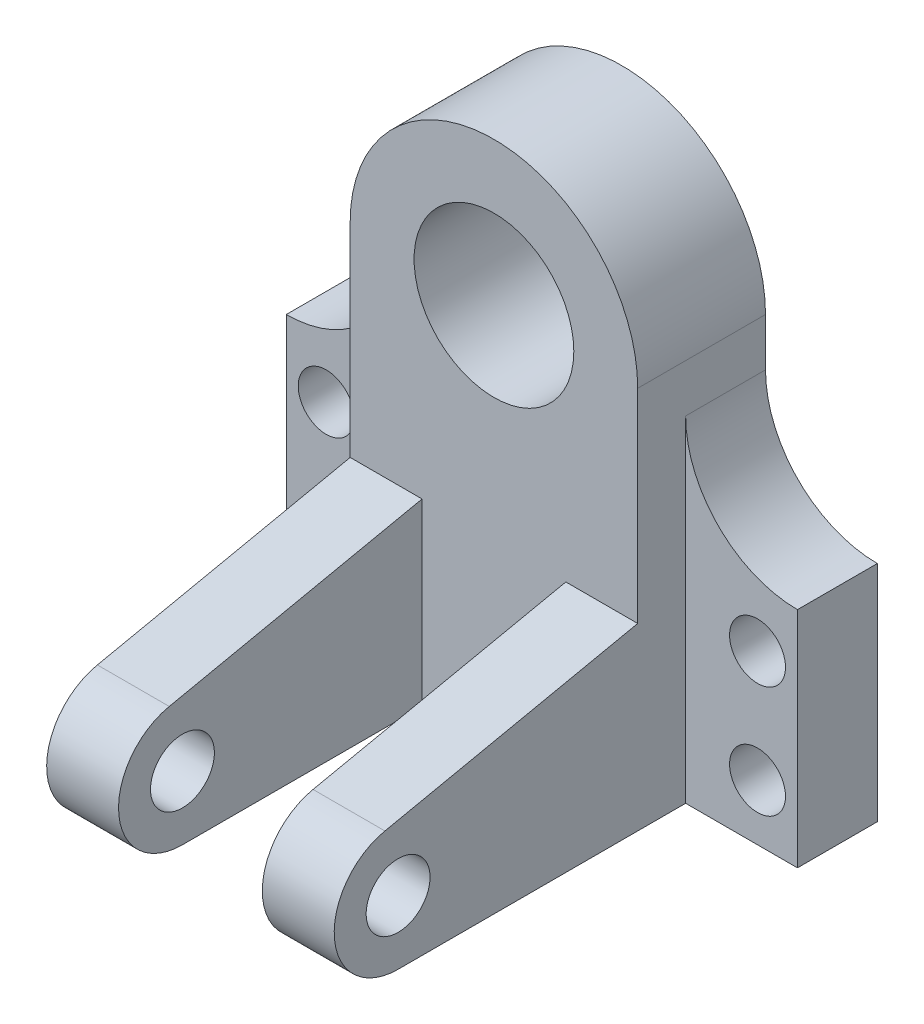
ISO-10303-21;
HEADER;
FILE_DESCRIPTION(('STEP AP214'),'2;1');
FILE_NAME('part.step','',(''),(''),'','','');
FILE_SCHEMA(('AUTOMOTIVE_DESIGN { 1 0 10303 214 1 1 1 1 }'));
ENDSEC;
DATA;
#1=APPLICATION_CONTEXT('core data for automotive mechanical design processes');
#2=APPLICATION_PROTOCOL_DEFINITION('international standard','automotive_design',2000,#1);
#3=PRODUCT_CONTEXT('',#1,'mechanical');
#4=PRODUCT('Part','Part','',(#3));
#5=PRODUCT_RELATED_PRODUCT_CATEGORY('part','',(#4));
#6=PRODUCT_DEFINITION_FORMATION('','',#4);
#7=PRODUCT_DEFINITION_CONTEXT('part definition',#1,'design');
#8=PRODUCT_DEFINITION('design','',#6,#7);
#9=PRODUCT_DEFINITION_SHAPE('','',#8);
#10=(LENGTH_UNIT() NAMED_UNIT(*) SI_UNIT(.MILLI.,.METRE.));
#11=(NAMED_UNIT(*) PLANE_ANGLE_UNIT() SI_UNIT($,.RADIAN.));
#12=(NAMED_UNIT(*) SI_UNIT($,.STERADIAN.) SOLID_ANGLE_UNIT());
#13=UNCERTAINTY_MEASURE_WITH_UNIT(LENGTH_MEASURE(1.E-05),#10,'distance_accuracy_value','');
#14=(GEOMETRIC_REPRESENTATION_CONTEXT(3) GLOBAL_UNCERTAINTY_ASSIGNED_CONTEXT((#13)) GLOBAL_UNIT_ASSIGNED_CONTEXT((#10,
#11,#12)) REPRESENTATION_CONTEXT('',''));
#15=CARTESIAN_POINT('',(0.,0.,0.));
#16=DIRECTION('',(0.,0.,1.));
#17=DIRECTION('',(1.,0.,0.));
#18=AXIS2_PLACEMENT_3D('',#15,#16,#17);
#19=CARTESIAN_POINT('',(0.,96.,32.));
#20=DIRECTION('',(0.,0.,1.));
#21=DIRECTION('',(1.,0.,0.));
#22=AXIS2_PLACEMENT_3D('',#19,#20,#21);
#23=PLANE('',#22);
#24=CARTESIAN_POINT('',(0.,96.,32.));
#25=DIRECTION('',(0.,0.,1.));
#26=DIRECTION('',(1.,0.,0.));
#27=AXIS2_PLACEMENT_3D('',#24,#25,#26);
#28=CIRCLE('',#27,20.);
#29=CARTESIAN_POINT('',(20.,96.,32.));
#30=VERTEX_POINT('',#29);
#31=EDGE_CURVE('E312',#30,#30,#28,.T.);
#32=ORIENTED_EDGE('',*,*,#31,.F.);
#33=EDGE_LOOP('',(#32));
#34=FACE_BOUND('',#33,.T.);
#35=DIRECTION('',(1.,0.,0.));
#36=VECTOR('',#35,1.);
#37=CARTESIAN_POINT('',(-36.,0.,32.));
#38=LINE('',#37,#36);
#39=CARTESIAN_POINT('',(-18.,0.,32.));
#40=VERTEX_POINT('',#39);
#41=CARTESIAN_POINT('',(18.,0.,32.));
#42=VERTEX_POINT('',#41);
#43=EDGE_CURVE('E66',#40,#42,#38,.T.);
#44=ORIENTED_EDGE('',*,*,#43,.T.);
#45=DIRECTION('',(0.,-1.,0.));
#46=VECTOR('',#45,1.);
#47=CARTESIAN_POINT('',(18.,45.,32.));
#48=LINE('',#47,#46);
#49=CARTESIAN_POINT('',(18.,45.,32.));
#50=VERTEX_POINT('',#49);
#51=EDGE_CURVE('E61',#50,#42,#48,.T.);
#52=ORIENTED_EDGE('',*,*,#51,.F.);
#53=DIRECTION('',(1.,0.,0.));
#54=VECTOR('',#53,1.);
#55=CARTESIAN_POINT('',(18.,45.,32.));
#56=LINE('',#55,#54);
#57=CARTESIAN_POINT('',(36.,45.,32.));
#58=VERTEX_POINT('',#57);
#59=EDGE_CURVE('E182',#50,#58,#56,.T.);
#60=ORIENTED_EDGE('',*,*,#59,.T.);
#61=DIRECTION('',(0.,1.,0.));
#62=VECTOR('',#61,1.);
#63=CARTESIAN_POINT('',(36.,0.,32.));
#64=LINE('',#63,#62);
#65=CARTESIAN_POINT('',(36.,96.,32.));
#66=VERTEX_POINT('',#65);
#67=EDGE_CURVE('E331',#58,#66,#64,.T.);
#68=ORIENTED_EDGE('',*,*,#67,.T.);
#69=CARTESIAN_POINT('',(0.,96.,32.));
#70=DIRECTION('',(0.,0.,1.));
#71=DIRECTION('',(1.,0.,0.));
#72=AXIS2_PLACEMENT_3D('',#69,#70,#71);
#73=CIRCLE('',#72,36.);
#74=CARTESIAN_POINT('',(-36.,96.,32.));
#75=VERTEX_POINT('',#74);
#76=EDGE_CURVE('E320',#66,#75,#73,.T.);
#77=ORIENTED_EDGE('',*,*,#76,.T.);
#78=DIRECTION('',(0.,-1.,0.));
#79=VECTOR('',#78,1.);
#80=CARTESIAN_POINT('',(-36.,96.,32.));
#81=LINE('',#80,#79);
#82=CARTESIAN_POINT('',(-36.,45.,32.));
#83=VERTEX_POINT('',#82);
#84=EDGE_CURVE('E324',#75,#83,#81,.T.);
#85=ORIENTED_EDGE('',*,*,#84,.T.);
#86=DIRECTION('',(-1.,0.,0.));
#87=VECTOR('',#86,1.);
#88=CARTESIAN_POINT('',(-18.,45.,32.));
#89=LINE('',#88,#87);
#90=CARTESIAN_POINT('',(-18.,45.,32.));
#91=VERTEX_POINT('',#90);
#92=EDGE_CURVE('E235',#91,#83,#89,.T.);
#93=ORIENTED_EDGE('',*,*,#92,.F.);
#94=DIRECTION('',(0.,-1.,0.));
#95=VECTOR('',#94,1.);
#96=CARTESIAN_POINT('',(-18.,45.,32.));
#97=LINE('',#96,#95);
#98=EDGE_CURVE('E212',#91,#40,#97,.T.);
#99=ORIENTED_EDGE('',*,*,#98,.T.);
#100=EDGE_LOOP('',(#44,#52,#60,#68,#77,#85,#93,#99));
#101=FACE_BOUND('',#100,.T.);
#102=ADVANCED_FACE('F45',(#34,#101),#23,.T.);
#103=CARTESIAN_POINT('',(0.,96.,0.));
#104=DIRECTION('',(0.,0.,1.));
#105=DIRECTION('',(1.,0.,0.));
#106=AXIS2_PLACEMENT_3D('',#103,#104,#105);
#107=PLANE('',#106);
#108=CARTESIAN_POINT('',(-54.,14.,0.));
#109=DIRECTION('',(0.,0.,1.));
#110=DIRECTION('',(1.,0.,0.));
#111=AXIS2_PLACEMENT_3D('',#108,#109,#110);
#112=CIRCLE('',#111,7.00000000000001);
#113=CARTESIAN_POINT('',(-47.,14.,0.));
#114=VERTEX_POINT('',#113);
#115=EDGE_CURVE('E687',#114,#114,#112,.T.);
#116=ORIENTED_EDGE('',*,*,#115,.T.);
#117=EDGE_LOOP('',(#116));
#118=FACE_BOUND('',#117,.T.);
#119=CARTESIAN_POINT('',(-54.,42.,0.));
#120=DIRECTION('',(0.,0.,1.));
#121=DIRECTION('',(1.,0.,0.));
#122=AXIS2_PLACEMENT_3D('',#119,#120,#121);
#123=CIRCLE('',#122,7.00000000000001);
#124=CARTESIAN_POINT('',(-47.,42.,0.));
#125=VERTEX_POINT('',#124);
#126=EDGE_CURVE('E679',#125,#125,#123,.T.);
#127=ORIENTED_EDGE('',*,*,#126,.T.);
#128=EDGE_LOOP('',(#127));
#129=FACE_BOUND('',#128,.T.);
#130=CARTESIAN_POINT('',(54.,14.,0.));
#131=DIRECTION('',(0.,0.,1.));
#132=DIRECTION('',(1.,0.,0.));
#133=AXIS2_PLACEMENT_3D('',#130,#131,#132);
#134=CIRCLE('',#133,7.00000000000001);
#135=CARTESIAN_POINT('',(61.,14.,0.));
#136=VERTEX_POINT('',#135);
#137=EDGE_CURVE('E671',#136,#136,#134,.T.);
#138=ORIENTED_EDGE('',*,*,#137,.T.);
#139=EDGE_LOOP('',(#138));
#140=FACE_BOUND('',#139,.T.);
#141=CARTESIAN_POINT('',(54.,42.,0.));
#142=DIRECTION('',(0.,0.,1.));
#143=DIRECTION('',(1.,0.,0.));
#144=AXIS2_PLACEMENT_3D('',#141,#142,#143);
#145=CIRCLE('',#144,7.00000000000001);
#146=CARTESIAN_POINT('',(61.,42.,0.));
#147=VERTEX_POINT('',#146);
#148=EDGE_CURVE('E660',#147,#147,#145,.T.);
#149=ORIENTED_EDGE('',*,*,#148,.T.);
#150=EDGE_LOOP('',(#149));
#151=FACE_BOUND('',#150,.T.);
#152=CARTESIAN_POINT('',(0.,96.,0.));
#153=DIRECTION('',(0.,0.,1.));
#154=DIRECTION('',(1.,0.,0.));
#155=AXIS2_PLACEMENT_3D('',#152,#153,#154);
#156=CIRCLE('',#155,36.);
#157=CARTESIAN_POINT('',(36.,96.,0.));
#158=VERTEX_POINT('',#157);
#159=CARTESIAN_POINT('',(-36.,96.,0.));
#160=VERTEX_POINT('',#159);
#161=EDGE_CURVE('E316',#158,#160,#156,.T.);
#162=ORIENTED_EDGE('',*,*,#161,.F.);
#163=DIRECTION('',(0.,1.,0.));
#164=VECTOR('',#163,1.);
#165=CARTESIAN_POINT('',(36.,0.,0.));
#166=LINE('',#165,#164);
#167=CARTESIAN_POINT('',(36.,84.,0.));
#168=VERTEX_POINT('',#167);
#169=EDGE_CURVE('E325',#168,#158,#166,.T.);
#170=ORIENTED_EDGE('',*,*,#169,.F.);
#171=CARTESIAN_POINT('',(64.,84.,0.));
#172=DIRECTION('',(0.,0.,-1.));
#173=DIRECTION('',(-1.,0.,0.));
#174=AXIS2_PLACEMENT_3D('',#171,#172,#173);
#175=CIRCLE('',#174,28.);
#176=CARTESIAN_POINT('',(64.,56.,0.));
#177=VERTEX_POINT('',#176);
#178=EDGE_CURVE('E284',#177,#168,#175,.T.);
#179=ORIENTED_EDGE('',*,*,#178,.F.);
#180=DIRECTION('',(0.,1.,0.));
#181=VECTOR('',#180,1.);
#182=CARTESIAN_POINT('',(64.,0.,0.));
#183=LINE('',#182,#181);
#184=CARTESIAN_POINT('',(64.,0.,0.));
#185=VERTEX_POINT('',#184);
#186=EDGE_CURVE('E278',#185,#177,#183,.T.);
#187=ORIENTED_EDGE('',*,*,#186,.F.);
#188=DIRECTION('',(1.,0.,0.));
#189=VECTOR('',#188,1.);
#190=CARTESIAN_POINT('',(-36.,0.,0.));
#191=LINE('',#190,#189);
#192=CARTESIAN_POINT('',(-64.,0.,0.));
#193=VERTEX_POINT('',#192);
#194=EDGE_CURVE('E342',#193,#185,#191,.T.);
#195=ORIENTED_EDGE('',*,*,#194,.F.);
#196=DIRECTION('',(0.,1.,0.));
#197=VECTOR('',#196,1.);
#198=CARTESIAN_POINT('',(-64.,0.,0.));
#199=LINE('',#198,#197);
#200=CARTESIAN_POINT('',(-64.,56.,0.));
#201=VERTEX_POINT('',#200);
#202=EDGE_CURVE('E250',#193,#201,#199,.T.);
#203=ORIENTED_EDGE('',*,*,#202,.T.);
#204=CARTESIAN_POINT('',(-64.,84.,0.));
#205=DIRECTION('',(0.,0.,1.));
#206=DIRECTION('',(1.,0.,0.));
#207=AXIS2_PLACEMENT_3D('',#204,#205,#206);
#208=CIRCLE('',#207,28.);
#209=CARTESIAN_POINT('',(-36.,84.,0.));
#210=VERTEX_POINT('',#209);
#211=EDGE_CURVE('E238',#201,#210,#208,.T.);
#212=ORIENTED_EDGE('',*,*,#211,.T.);
#213=DIRECTION('',(0.,-1.,0.));
#214=VECTOR('',#213,1.);
#215=CARTESIAN_POINT('',(-36.,96.,0.));
#216=LINE('',#215,#214);
#217=EDGE_CURVE('E338',#160,#210,#216,.T.);
#218=ORIENTED_EDGE('',*,*,#217,.F.);
#219=EDGE_LOOP('',(#162,#170,#179,#187,#195,#203,#212,#218));
#220=FACE_BOUND('',#219,.T.);
#221=CARTESIAN_POINT('',(0.,96.,0.));
#222=DIRECTION('',(0.,0.,1.));
#223=DIRECTION('',(1.,0.,0.));
#224=AXIS2_PLACEMENT_3D('',#221,#222,#223);
#225=CIRCLE('',#224,20.);
#226=CARTESIAN_POINT('',(20.,96.,0.));
#227=VERTEX_POINT('',#226);
#228=EDGE_CURVE('E311',#227,#227,#225,.T.);
#229=ORIENTED_EDGE('',*,*,#228,.T.);
#230=EDGE_LOOP('',(#229));
#231=FACE_BOUND('',#230,.T.);
#232=ADVANCED_FACE('F382',(#118,#129,#140,#151,#220,#231),#107,.F.);
#233=CARTESIAN_POINT('',(0.,96.,32.));
#234=DIRECTION('',(0.,0.,-1.));
#235=DIRECTION('',(-1.,0.,0.));
#236=AXIS2_PLACEMENT_3D('',#233,#234,#235);
#237=CYLINDRICAL_SURFACE('',#236,36.);
#238=ORIENTED_EDGE('',*,*,#161,.T.);
#239=DIRECTION('',(0.,0.,-1.));
#240=VECTOR('',#239,1.);
#241=CARTESIAN_POINT('',(-36.,96.,32.));
#242=LINE('',#241,#240);
#243=EDGE_CURVE('E11',#75,#160,#242,.T.);
#244=ORIENTED_EDGE('',*,*,#243,.F.);
#245=ORIENTED_EDGE('',*,*,#76,.F.);
#246=DIRECTION('',(0.,0.,-1.));
#247=VECTOR('',#246,1.);
#248=CARTESIAN_POINT('',(36.,96.,32.));
#249=LINE('',#248,#247);
#250=EDGE_CURVE('E334',#66,#158,#249,.T.);
#251=ORIENTED_EDGE('',*,*,#250,.T.);
#252=EDGE_LOOP('',(#238,#244,#245,#251));
#253=FACE_BOUND('',#252,.T.);
#254=ADVANCED_FACE('F47',(#253),#237,.T.);
#255=CARTESIAN_POINT('',(-36.,96.,32.));
#256=DIRECTION('',(1.,0.,0.));
#257=DIRECTION('',(0.,1.,0.));
#258=AXIS2_PLACEMENT_3D('',#255,#256,#257);
#259=PLANE('',#258);
#260=ORIENTED_EDGE('',*,*,#217,.T.);
#261=DIRECTION('',(0.,0.,-1.));
#262=VECTOR('',#261,1.);
#263=CARTESIAN_POINT('',(-36.,84.,20.));
#264=LINE('',#263,#262);
#265=CARTESIAN_POINT('',(-36.,84.,20.));
#266=VERTEX_POINT('',#265);
#267=EDGE_CURVE('E275',#266,#210,#264,.T.);
#268=ORIENTED_EDGE('',*,*,#267,.F.);
#269=DIRECTION('',(0.,-1.,0.));
#270=VECTOR('',#269,1.);
#271=CARTESIAN_POINT('',(-36.,84.,20.));
#272=LINE('',#271,#270);
#273=CARTESIAN_POINT('',(-36.,0.,20.));
#274=VERTEX_POINT('',#273);
#275=EDGE_CURVE('E245',#266,#274,#272,.T.);
#276=ORIENTED_EDGE('',*,*,#275,.T.);
#277=DIRECTION('',(0.,0.,-1.));
#278=VECTOR('',#277,1.);
#279=CARTESIAN_POINT('',(-36.,0.,32.));
#280=LINE('',#279,#278);
#281=CARTESIAN_POINT('',(-36.,0.,92.));
#282=VERTEX_POINT('',#281);
#283=EDGE_CURVE('E54',#282,#274,#280,.T.);
#284=ORIENTED_EDGE('',*,*,#283,.F.);
#285=CARTESIAN_POINT('',(-36.,16.,92.));
#286=DIRECTION('',(-1.,0.,0.));
#287=DIRECTION('',(0.,-1.,0.));
#288=AXIS2_PLACEMENT_3D('',#285,#286,#287);
#289=CIRCLE('',#288,16.);
#290=CARTESIAN_POINT('',(-36.,31.655913740194,95.3003583077605));
#291=VERTEX_POINT('',#290);
#292=EDGE_CURVE('E208',#282,#291,#289,.T.);
#293=ORIENTED_EDGE('',*,*,#292,.T.);
#294=DIRECTION('',(0.,0.206272394235029,-0.978494608762127));
#295=VECTOR('',#294,1.);
#296=CARTESIAN_POINT('',(-36.,31.655913740194,95.3003583077605));
#297=LINE('',#296,#295);
#298=EDGE_CURVE('E216',#291,#83,#297,.T.);
#299=ORIENTED_EDGE('',*,*,#298,.T.);
#300=ORIENTED_EDGE('',*,*,#84,.F.);
#301=ORIENTED_EDGE('',*,*,#243,.T.);
#302=EDGE_LOOP('',(#260,#268,#276,#284,#293,#299,#300,#301));
#303=FACE_BOUND('',#302,.T.);
#304=CARTESIAN_POINT('',(-36.,16.,92.));
#305=DIRECTION('',(-1.,0.,0.));
#306=DIRECTION('',(0.,-1.,0.));
#307=AXIS2_PLACEMENT_3D('',#304,#305,#306);
#308=CIRCLE('',#307,8.00000000000001);
#309=CARTESIAN_POINT('',(-36.,7.99999999999998,92.));
#310=VERTEX_POINT('',#309);
#311=EDGE_CURVE('E200',#310,#310,#308,.T.);
#312=ORIENTED_EDGE('',*,*,#311,.F.);
#313=EDGE_LOOP('',(#312));
#314=FACE_BOUND('',#313,.T.);
#315=ADVANCED_FACE('F358',(#303,#314),#259,.F.);
#316=CARTESIAN_POINT('',(-36.,0.,32.));
#317=DIRECTION('',(0.,1.,0.));
#318=DIRECTION('',(0.,0.,1.));
#319=AXIS2_PLACEMENT_3D('',#316,#317,#318);
#320=PLANE('',#319);
#321=ORIENTED_EDGE('',*,*,#194,.T.);
#322=DIRECTION('',(0.,0.,-1.));
#323=VECTOR('',#322,1.);
#324=CARTESIAN_POINT('',(64.,0.,20.));
#325=LINE('',#324,#323);
#326=CARTESIAN_POINT('',(64.,0.,20.));
#327=VERTEX_POINT('',#326);
#328=EDGE_CURVE('E307',#327,#185,#325,.T.);
#329=ORIENTED_EDGE('',*,*,#328,.F.);
#330=DIRECTION('',(1.,0.,0.));
#331=VECTOR('',#330,1.);
#332=CARTESIAN_POINT('',(36.,0.,20.));
#333=LINE('',#332,#331);
#334=CARTESIAN_POINT('',(36.,0.,20.));
#335=VERTEX_POINT('',#334);
#336=EDGE_CURVE('E283',#335,#327,#333,.T.);
#337=ORIENTED_EDGE('',*,*,#336,.F.);
#338=DIRECTION('',(0.,0.,-1.));
#339=VECTOR('',#338,1.);
#340=CARTESIAN_POINT('',(36.,0.,32.));
#341=LINE('',#340,#339);
#342=CARTESIAN_POINT('',(36.,0.,92.));
#343=VERTEX_POINT('',#342);
#344=EDGE_CURVE('E350',#343,#335,#341,.T.);
#345=ORIENTED_EDGE('',*,*,#344,.F.);
#346=DIRECTION('',(1.,0.,0.));
#347=VECTOR('',#346,1.);
#348=CARTESIAN_POINT('',(18.,0.,92.));
#349=LINE('',#348,#347);
#350=CARTESIAN_POINT('',(18.,0.,92.));
#351=VERTEX_POINT('',#350);
#352=EDGE_CURVE('E181',#351,#343,#349,.T.);
#353=ORIENTED_EDGE('',*,*,#352,.F.);
#354=DIRECTION('',(0.,0.,1.));
#355=VECTOR('',#354,1.);
#356=CARTESIAN_POINT('',(18.,0.,32.));
#357=LINE('',#356,#355);
#358=EDGE_CURVE('E166',#42,#351,#357,.T.);
#359=ORIENTED_EDGE('',*,*,#358,.F.);
#360=ORIENTED_EDGE('',*,*,#43,.F.);
#361=DIRECTION('',(0.,0.,1.));
#362=VECTOR('',#361,1.);
#363=CARTESIAN_POINT('',(-18.,0.,32.));
#364=LINE('',#363,#362);
#365=CARTESIAN_POINT('',(-18.,0.,92.));
#366=VERTEX_POINT('',#365);
#367=EDGE_CURVE('E215',#40,#366,#364,.T.);
#368=ORIENTED_EDGE('',*,*,#367,.T.);
#369=DIRECTION('',(-1.,0.,0.));
#370=VECTOR('',#369,1.);
#371=CARTESIAN_POINT('',(-18.,0.,92.));
#372=LINE('',#371,#370);
#373=EDGE_CURVE('E228',#366,#282,#372,.T.);
#374=ORIENTED_EDGE('',*,*,#373,.T.);
#375=ORIENTED_EDGE('',*,*,#283,.T.);
#376=DIRECTION('',(-1.,0.,0.));
#377=VECTOR('',#376,1.);
#378=CARTESIAN_POINT('',(-36.,0.,20.));
#379=LINE('',#378,#377);
#380=CARTESIAN_POINT('',(-64.,0.,20.));
#381=VERTEX_POINT('',#380);
#382=EDGE_CURVE('E258',#274,#381,#379,.T.);
#383=ORIENTED_EDGE('',*,*,#382,.T.);
#384=DIRECTION('',(0.,0.,-1.));
#385=VECTOR('',#384,1.);
#386=CARTESIAN_POINT('',(-64.,0.,20.));
#387=LINE('',#386,#385);
#388=EDGE_CURVE('E262',#381,#193,#387,.T.);
#389=ORIENTED_EDGE('',*,*,#388,.T.);
#390=EDGE_LOOP('',(#321,#329,#337,#345,#353,#359,#360,#368,#374,#375,#383,#389));
#391=FACE_BOUND('',#390,.T.);
#392=ADVANCED_FACE('F355',(#391),#320,.F.);
#393=CARTESIAN_POINT('',(36.,0.,32.));
#394=DIRECTION('',(-1.,0.,0.));
#395=DIRECTION('',(0.,-1.,0.));
#396=AXIS2_PLACEMENT_3D('',#393,#394,#395);
#397=PLANE('',#396);
#398=DIRECTION('',(0.,-1.,0.));
#399=VECTOR('',#398,1.);
#400=CARTESIAN_POINT('',(36.,84.,20.));
#401=LINE('',#400,#399);
#402=CARTESIAN_POINT('',(36.,84.,20.));
#403=VERTEX_POINT('',#402);
#404=EDGE_CURVE('E279',#403,#335,#401,.T.);
#405=ORIENTED_EDGE('',*,*,#404,.F.);
#406=DIRECTION('',(0.,0.,-1.));
#407=VECTOR('',#406,1.);
#408=CARTESIAN_POINT('',(36.,84.,20.));
#409=LINE('',#408,#407);
#410=EDGE_CURVE('E294',#403,#168,#409,.T.);
#411=ORIENTED_EDGE('',*,*,#410,.T.);
#412=ORIENTED_EDGE('',*,*,#169,.T.);
#413=ORIENTED_EDGE('',*,*,#250,.F.);
#414=ORIENTED_EDGE('',*,*,#67,.F.);
#415=DIRECTION('',(0.,0.206272394235029,-0.978494608762127));
#416=VECTOR('',#415,1.);
#417=CARTESIAN_POINT('',(36.,31.655913740194,95.3003583077605));
#418=LINE('',#417,#416);
#419=CARTESIAN_POINT('',(36.,31.655913740194,95.3003583077605));
#420=VERTEX_POINT('',#419);
#421=EDGE_CURVE('E193',#420,#58,#418,.T.);
#422=ORIENTED_EDGE('',*,*,#421,.F.);
#423=CARTESIAN_POINT('',(36.,16.,92.));
#424=DIRECTION('',(-1.,0.,0.));
#425=DIRECTION('',(0.,-1.,0.));
#426=AXIS2_PLACEMENT_3D('',#423,#424,#425);
#427=CIRCLE('',#426,16.);
#428=EDGE_CURVE('E176',#343,#420,#427,.T.);
#429=ORIENTED_EDGE('',*,*,#428,.F.);
#430=ORIENTED_EDGE('',*,*,#344,.T.);
#431=EDGE_LOOP('',(#405,#411,#412,#413,#414,#422,#429,#430));
#432=FACE_BOUND('',#431,.T.);
#433=CARTESIAN_POINT('',(36.,16.,92.));
#434=DIRECTION('',(-1.,0.,0.));
#435=DIRECTION('',(0.,-1.,0.));
#436=AXIS2_PLACEMENT_3D('',#433,#434,#435);
#437=CIRCLE('',#436,8.00000000000001);
#438=CARTESIAN_POINT('',(36.,7.99999999999998,92.));
#439=VERTEX_POINT('',#438);
#440=EDGE_CURVE('E658',#439,#439,#437,.T.);
#441=ORIENTED_EDGE('',*,*,#440,.T.);
#442=EDGE_LOOP('',(#441));
#443=FACE_BOUND('',#442,.T.);
#444=ADVANCED_FACE('F391',(#432,#443),#397,.F.);
#445=CARTESIAN_POINT('',(0.,96.,32.));
#446=DIRECTION('',(0.,0.,-1.));
#447=DIRECTION('',(-1.,0.,0.));
#448=AXIS2_PLACEMENT_3D('',#445,#446,#447);
#449=CYLINDRICAL_SURFACE('',#448,20.);
#450=ORIENTED_EDGE('',*,*,#31,.T.);
#451=EDGE_LOOP('',(#450));
#452=FACE_BOUND('',#451,.T.);
#453=ORIENTED_EDGE('',*,*,#228,.F.);
#454=EDGE_LOOP('',(#453));
#455=FACE_BOUND('',#454,.T.);
#456=ADVANCED_FACE('F407',(#452,#455),#449,.F.);
#457=CARTESIAN_POINT('',(64.,0.,20.));
#458=DIRECTION('',(-1.,0.,0.));
#459=DIRECTION('',(0.,0.,1.));
#460=AXIS2_PLACEMENT_3D('',#457,#458,#459);
#461=PLANE('',#460);
#462=ORIENTED_EDGE('',*,*,#186,.T.);
#463=DIRECTION('',(0.,0.,-1.));
#464=VECTOR('',#463,1.);
#465=CARTESIAN_POINT('',(64.,56.,20.));
#466=LINE('',#465,#464);
#467=CARTESIAN_POINT('',(64.,56.,20.));
#468=VERTEX_POINT('',#467);
#469=EDGE_CURVE('E303',#468,#177,#466,.T.);
#470=ORIENTED_EDGE('',*,*,#469,.F.);
#471=DIRECTION('',(0.,1.,0.));
#472=VECTOR('',#471,1.);
#473=CARTESIAN_POINT('',(64.,0.,20.));
#474=LINE('',#473,#472);
#475=EDGE_CURVE('E287',#327,#468,#474,.T.);
#476=ORIENTED_EDGE('',*,*,#475,.F.);
#477=ORIENTED_EDGE('',*,*,#328,.T.);
#478=EDGE_LOOP('',(#462,#470,#476,#477));
#479=FACE_BOUND('',#478,.T.);
#480=ADVANCED_FACE('F378',(#479),#461,.F.);
#481=CARTESIAN_POINT('',(64.,84.,20.));
#482=DIRECTION('',(0.,0.,-1.));
#483=DIRECTION('',(-1.,0.,0.));
#484=AXIS2_PLACEMENT_3D('',#481,#482,#483);
#485=CYLINDRICAL_SURFACE('',#484,28.);
#486=ORIENTED_EDGE('',*,*,#178,.T.);
#487=ORIENTED_EDGE('',*,*,#410,.F.);
#488=CARTESIAN_POINT('',(64.,84.,20.));
#489=DIRECTION('',(0.,0.,-1.));
#490=DIRECTION('',(-1.,0.,0.));
#491=AXIS2_PLACEMENT_3D('',#488,#489,#490);
#492=CIRCLE('',#491,28.);
#493=EDGE_CURVE('E290',#468,#403,#492,.T.);
#494=ORIENTED_EDGE('',*,*,#493,.F.);
#495=ORIENTED_EDGE('',*,*,#469,.T.);
#496=EDGE_LOOP('',(#486,#487,#494,#495));
#497=FACE_BOUND('',#496,.T.);
#498=ADVANCED_FACE('F386',(#497),#485,.F.);
#499=CARTESIAN_POINT('',(64.,84.,20.));
#500=DIRECTION('',(0.,0.,-1.));
#501=DIRECTION('',(-1.,0.,0.));
#502=AXIS2_PLACEMENT_3D('',#499,#500,#501);
#503=PLANE('',#502);
#504=CARTESIAN_POINT('',(54.,14.,20.));
#505=DIRECTION('',(0.,0.,1.));
#506=DIRECTION('',(1.,0.,0.));
#507=AXIS2_PLACEMENT_3D('',#504,#505,#506);
#508=CIRCLE('',#507,7.00000000000001);
#509=CARTESIAN_POINT('',(61.,14.,20.));
#510=VERTEX_POINT('',#509);
#511=EDGE_CURVE('E675',#510,#510,#508,.T.);
#512=ORIENTED_EDGE('',*,*,#511,.F.);
#513=EDGE_LOOP('',(#512));
#514=FACE_BOUND('',#513,.T.);
#515=CARTESIAN_POINT('',(54.,42.,20.));
#516=DIRECTION('',(0.,0.,1.));
#517=DIRECTION('',(1.,0.,0.));
#518=AXIS2_PLACEMENT_3D('',#515,#516,#517);
#519=CIRCLE('',#518,7.00000000000001);
#520=CARTESIAN_POINT('',(61.,42.,20.));
#521=VERTEX_POINT('',#520);
#522=EDGE_CURVE('E665',#521,#521,#519,.T.);
#523=ORIENTED_EDGE('',*,*,#522,.F.);
#524=EDGE_LOOP('',(#523));
#525=FACE_BOUND('',#524,.T.);
#526=ORIENTED_EDGE('',*,*,#404,.T.);
#527=ORIENTED_EDGE('',*,*,#336,.T.);
#528=ORIENTED_EDGE('',*,*,#475,.T.);
#529=ORIENTED_EDGE('',*,*,#493,.T.);
#530=EDGE_LOOP('',(#526,#527,#528,#529));
#531=FACE_BOUND('',#530,.T.);
#532=ADVANCED_FACE('F389',(#514,#525,#531),#503,.F.);
#533=CARTESIAN_POINT('',(-64.,84.,20.));
#534=DIRECTION('',(0.,0.,-1.));
#535=DIRECTION('',(-1.,0.,0.));
#536=AXIS2_PLACEMENT_3D('',#533,#534,#535);
#537=CYLINDRICAL_SURFACE('',#536,28.);
#538=ORIENTED_EDGE('',*,*,#211,.F.);
#539=DIRECTION('',(0.,0.,-1.));
#540=VECTOR('',#539,1.);
#541=CARTESIAN_POINT('',(-64.,56.,20.));
#542=LINE('',#541,#540);
#543=CARTESIAN_POINT('',(-64.,56.,20.));
#544=VERTEX_POINT('',#543);
#545=EDGE_CURVE('E272',#544,#201,#542,.T.);
#546=ORIENTED_EDGE('',*,*,#545,.F.);
#547=CARTESIAN_POINT('',(-64.,84.,20.));
#548=DIRECTION('',(0.,0.,1.));
#549=DIRECTION('',(1.,0.,0.));
#550=AXIS2_PLACEMENT_3D('',#547,#548,#549);
#551=CIRCLE('',#550,28.);
#552=EDGE_CURVE('E249',#544,#266,#551,.T.);
#553=ORIENTED_EDGE('',*,*,#552,.T.);
#554=ORIENTED_EDGE('',*,*,#267,.T.);
#555=EDGE_LOOP('',(#538,#546,#553,#554));
#556=FACE_BOUND('',#555,.T.);
#557=ADVANCED_FACE('F368',(#556),#537,.F.);
#558=CARTESIAN_POINT('',(-64.,0.,20.));
#559=DIRECTION('',(-1.,0.,0.));
#560=DIRECTION('',(0.,0.,1.));
#561=AXIS2_PLACEMENT_3D('',#558,#559,#560);
#562=PLANE('',#561);
#563=ORIENTED_EDGE('',*,*,#202,.F.);
#564=ORIENTED_EDGE('',*,*,#388,.F.);
#565=DIRECTION('',(0.,1.,0.));
#566=VECTOR('',#565,1.);
#567=CARTESIAN_POINT('',(-64.,0.,20.));
#568=LINE('',#567,#566);
#569=EDGE_CURVE('E254',#381,#544,#568,.T.);
#570=ORIENTED_EDGE('',*,*,#569,.T.);
#571=ORIENTED_EDGE('',*,*,#545,.T.);
#572=EDGE_LOOP('',(#563,#564,#570,#571));
#573=FACE_BOUND('',#572,.T.);
#574=ADVANCED_FACE('F371',(#573),#562,.T.);
#575=CARTESIAN_POINT('',(-64.,84.,20.));
#576=DIRECTION('',(0.,0.,-1.));
#577=DIRECTION('',(1.,0.,0.));
#578=AXIS2_PLACEMENT_3D('',#575,#576,#577);
#579=PLANE('',#578);
#580=CARTESIAN_POINT('',(-54.,14.,20.));
#581=DIRECTION('',(0.,0.,1.));
#582=DIRECTION('',(1.,0.,0.));
#583=AXIS2_PLACEMENT_3D('',#580,#581,#582);
#584=CIRCLE('',#583,7.00000000000001);
#585=CARTESIAN_POINT('',(-47.,14.,20.));
#586=VERTEX_POINT('',#585);
#587=EDGE_CURVE('E691',#586,#586,#584,.T.);
#588=ORIENTED_EDGE('',*,*,#587,.F.);
#589=EDGE_LOOP('',(#588));
#590=FACE_BOUND('',#589,.T.);
#591=CARTESIAN_POINT('',(-54.,42.,20.));
#592=DIRECTION('',(0.,0.,1.));
#593=DIRECTION('',(1.,0.,0.));
#594=AXIS2_PLACEMENT_3D('',#591,#592,#593);
#595=CIRCLE('',#594,7.00000000000001);
#596=CARTESIAN_POINT('',(-47.,42.,20.));
#597=VERTEX_POINT('',#596);
#598=EDGE_CURVE('E683',#597,#597,#595,.T.);
#599=ORIENTED_EDGE('',*,*,#598,.F.);
#600=EDGE_LOOP('',(#599));
#601=FACE_BOUND('',#600,.T.);
#602=ORIENTED_EDGE('',*,*,#275,.F.);
#603=ORIENTED_EDGE('',*,*,#552,.F.);
#604=ORIENTED_EDGE('',*,*,#569,.F.);
#605=ORIENTED_EDGE('',*,*,#382,.F.);
#606=EDGE_LOOP('',(#602,#603,#604,#605));
#607=FACE_BOUND('',#606,.T.);
#608=ADVANCED_FACE('F364',(#590,#601,#607),#579,.F.);
#609=CARTESIAN_POINT('',(-18.,31.655913740194,95.3003583077605));
#610=DIRECTION('',(0.,0.978494608762127,0.206272394235029));
#611=DIRECTION('',(0.,-0.206272394235029,0.978494608762128));
#612=AXIS2_PLACEMENT_3D('',#609,#610,#611);
#613=PLANE('',#612);
#614=ORIENTED_EDGE('',*,*,#298,.F.);
#615=DIRECTION('',(-1.,0.,0.));
#616=VECTOR('',#615,1.);
#617=CARTESIAN_POINT('',(-18.,31.655913740194,95.3003583077605));
#618=LINE('',#617,#616);
#619=CARTESIAN_POINT('',(-18.,31.655913740194,95.3003583077605));
#620=VERTEX_POINT('',#619);
#621=EDGE_CURVE('E239',#620,#291,#618,.T.);
#622=ORIENTED_EDGE('',*,*,#621,.F.);
#623=DIRECTION('',(0.,0.206272394235029,-0.978494608762127));
#624=VECTOR('',#623,1.);
#625=CARTESIAN_POINT('',(-18.,31.655913740194,95.3003583077605));
#626=LINE('',#625,#624);
#627=EDGE_CURVE('E224',#620,#91,#626,.T.);
#628=ORIENTED_EDGE('',*,*,#627,.T.);
#629=ORIENTED_EDGE('',*,*,#92,.T.);
#630=EDGE_LOOP('',(#614,#622,#628,#629));
#631=FACE_BOUND('',#630,.T.);
#632=ADVANCED_FACE('F425',(#631),#613,.T.);
#633=CARTESIAN_POINT('',(-18.,16.,92.));
#634=DIRECTION('',(-1.,0.,0.));
#635=DIRECTION('',(0.,-1.,0.));
#636=AXIS2_PLACEMENT_3D('',#633,#634,#635);
#637=CYLINDRICAL_SURFACE('',#636,16.);
#638=ORIENTED_EDGE('',*,*,#292,.F.);
#639=ORIENTED_EDGE('',*,*,#373,.F.);
#640=CARTESIAN_POINT('',(-18.,16.,92.));
#641=DIRECTION('',(-1.,0.,0.));
#642=DIRECTION('',(0.,-1.,0.));
#643=AXIS2_PLACEMENT_3D('',#640,#641,#642);
#644=CIRCLE('',#643,16.);
#645=EDGE_CURVE('E220',#366,#620,#644,.T.);
#646=ORIENTED_EDGE('',*,*,#645,.T.);
#647=ORIENTED_EDGE('',*,*,#621,.T.);
#648=EDGE_LOOP('',(#638,#639,#646,#647));
#649=FACE_BOUND('',#648,.T.);
#650=ADVANCED_FACE('F431',(#649),#637,.T.);
#651=CARTESIAN_POINT('',(-18.,16.,92.));
#652=DIRECTION('',(-1.,0.,0.));
#653=DIRECTION('',(0.,-1.,0.));
#654=AXIS2_PLACEMENT_3D('',#651,#652,#653);
#655=PLANE('',#654);
#656=CARTESIAN_POINT('',(-18.,16.,92.));
#657=DIRECTION('',(-1.,0.,0.));
#658=DIRECTION('',(0.,-1.,0.));
#659=AXIS2_PLACEMENT_3D('',#656,#657,#658);
#660=CIRCLE('',#659,8.00000000000001);
#661=CARTESIAN_POINT('',(-18.,7.99999999999998,92.));
#662=VERTEX_POINT('',#661);
#663=EDGE_CURVE('E204',#662,#662,#660,.T.);
#664=ORIENTED_EDGE('',*,*,#663,.T.);
#665=EDGE_LOOP('',(#664));
#666=FACE_BOUND('',#665,.T.);
#667=ORIENTED_EDGE('',*,*,#98,.F.);
#668=ORIENTED_EDGE('',*,*,#627,.F.);
#669=ORIENTED_EDGE('',*,*,#645,.F.);
#670=ORIENTED_EDGE('',*,*,#367,.F.);
#671=EDGE_LOOP('',(#667,#668,#669,#670));
#672=FACE_BOUND('',#671,.T.);
#673=ADVANCED_FACE('F429',(#666,#672),#655,.F.);
#674=CARTESIAN_POINT('',(-18.,16.,92.));
#675=DIRECTION('',(-1.,0.,0.));
#676=DIRECTION('',(0.,-1.,0.));
#677=AXIS2_PLACEMENT_3D('',#674,#675,#676);
#678=CYLINDRICAL_SURFACE('',#677,8.00000000000001);
#679=ORIENTED_EDGE('',*,*,#663,.F.);
#680=EDGE_LOOP('',(#679));
#681=FACE_BOUND('',#680,.T.);
#682=ORIENTED_EDGE('',*,*,#311,.T.);
#683=EDGE_LOOP('',(#682));
#684=FACE_BOUND('',#683,.T.);
#685=ADVANCED_FACE('F437',(#681,#684),#678,.F.);
#686=CARTESIAN_POINT('',(18.,16.,92.));
#687=DIRECTION('',(1.,0.,0.));
#688=DIRECTION('',(0.,-1.,0.));
#689=AXIS2_PLACEMENT_3D('',#686,#687,#688);
#690=PLANE('',#689);
#691=ORIENTED_EDGE('',*,*,#51,.T.);
#692=ORIENTED_EDGE('',*,*,#358,.T.);
#693=CARTESIAN_POINT('',(18.,16.,92.));
#694=DIRECTION('',(-1.,0.,0.));
#695=DIRECTION('',(0.,-1.,0.));
#696=AXIS2_PLACEMENT_3D('',#693,#694,#695);
#697=CIRCLE('',#696,16.);
#698=CARTESIAN_POINT('',(18.,31.655913740194,95.3003583077605));
#699=VERTEX_POINT('',#698);
#700=EDGE_CURVE('E159',#351,#699,#697,.T.);
#701=ORIENTED_EDGE('',*,*,#700,.T.);
#702=DIRECTION('',(0.,0.206272394235029,-0.978494608762127));
#703=VECTOR('',#702,1.);
#704=CARTESIAN_POINT('',(18.,31.655913740194,95.3003583077605));
#705=LINE('',#704,#703);
#706=EDGE_CURVE('E164',#699,#50,#705,.T.);
#707=ORIENTED_EDGE('',*,*,#706,.T.);
#708=EDGE_LOOP('',(#691,#692,#701,#707));
#709=FACE_BOUND('',#708,.T.);
#710=CARTESIAN_POINT('',(18.,16.,92.));
#711=DIRECTION('',(-1.,0.,0.));
#712=DIRECTION('',(0.,-1.,0.));
#713=AXIS2_PLACEMENT_3D('',#710,#711,#712);
#714=CIRCLE('',#713,8.00000000000001);
#715=CARTESIAN_POINT('',(18.,7.99999999999998,92.));
#716=VERTEX_POINT('',#715);
#717=EDGE_CURVE('E196',#716,#716,#714,.T.);
#718=ORIENTED_EDGE('',*,*,#717,.F.);
#719=EDGE_LOOP('',(#718));
#720=FACE_BOUND('',#719,.T.);
#721=ADVANCED_FACE('F161',(#709,#720),#690,.F.);
#722=CARTESIAN_POINT('',(18.,16.,92.));
#723=DIRECTION('',(1.,0.,0.));
#724=DIRECTION('',(0.,1.,0.));
#725=AXIS2_PLACEMENT_3D('',#722,#723,#724);
#726=CYLINDRICAL_SURFACE('',#725,16.);
#727=ORIENTED_EDGE('',*,*,#428,.T.);
#728=DIRECTION('',(1.,0.,0.));
#729=VECTOR('',#728,1.);
#730=CARTESIAN_POINT('',(18.,31.655913740194,95.3003583077605));
#731=LINE('',#730,#729);
#732=EDGE_CURVE('E173',#699,#420,#731,.T.);
#733=ORIENTED_EDGE('',*,*,#732,.F.);
#734=ORIENTED_EDGE('',*,*,#700,.F.);
#735=ORIENTED_EDGE('',*,*,#352,.T.);
#736=EDGE_LOOP('',(#727,#733,#734,#735));
#737=FACE_BOUND('',#736,.T.);
#738=ADVANCED_FACE('F174',(#737),#726,.T.);
#739=CARTESIAN_POINT('',(18.,31.655913740194,95.3003583077605));
#740=DIRECTION('',(0.,-0.978494608762127,-0.206272394235029));
#741=DIRECTION('',(0.,0.206272394235029,-0.978494608762128));
#742=AXIS2_PLACEMENT_3D('',#739,#740,#741);
#743=PLANE('',#742);
#744=ORIENTED_EDGE('',*,*,#421,.T.);
#745=ORIENTED_EDGE('',*,*,#59,.F.);
#746=ORIENTED_EDGE('',*,*,#706,.F.);
#747=ORIENTED_EDGE('',*,*,#732,.T.);
#748=EDGE_LOOP('',(#744,#745,#746,#747));
#749=FACE_BOUND('',#748,.T.);
#750=ADVANCED_FACE('F184',(#749),#743,.F.);
#751=CARTESIAN_POINT('',(18.,16.,92.));
#752=DIRECTION('',(1.,0.,0.));
#753=DIRECTION('',(0.,1.,0.));
#754=AXIS2_PLACEMENT_3D('',#751,#752,#753);
#755=CYLINDRICAL_SURFACE('',#754,8.00000000000001);
#756=ORIENTED_EDGE('',*,*,#717,.T.);
#757=EDGE_LOOP('',(#756));
#758=FACE_BOUND('',#757,.T.);
#759=ORIENTED_EDGE('',*,*,#440,.F.);
#760=EDGE_LOOP('',(#759));
#761=FACE_BOUND('',#760,.T.);
#762=ADVANCED_FACE('F511',(#758,#761),#755,.F.);
#763=CARTESIAN_POINT('',(54.,42.,20.));
#764=DIRECTION('',(0.,0.,1.));
#765=DIRECTION('',(1.,0.,0.));
#766=AXIS2_PLACEMENT_3D('',#763,#764,#765);
#767=CYLINDRICAL_SURFACE('',#766,7.00000000000001);
#768=ORIENTED_EDGE('',*,*,#522,.T.);
#769=EDGE_LOOP('',(#768));
#770=FACE_BOUND('',#769,.T.);
#771=ORIENTED_EDGE('',*,*,#148,.F.);
#772=EDGE_LOOP('',(#771));
#773=FACE_BOUND('',#772,.T.);
#774=ADVANCED_FACE('F515',(#770,#773),#767,.F.);
#775=CARTESIAN_POINT('',(54.,14.,20.));
#776=DIRECTION('',(0.,0.,1.));
#777=DIRECTION('',(1.,0.,0.));
#778=AXIS2_PLACEMENT_3D('',#775,#776,#777);
#779=CYLINDRICAL_SURFACE('',#778,7.00000000000001);
#780=ORIENTED_EDGE('',*,*,#511,.T.);
#781=EDGE_LOOP('',(#780));
#782=FACE_BOUND('',#781,.T.);
#783=ORIENTED_EDGE('',*,*,#137,.F.);
#784=EDGE_LOOP('',(#783));
#785=FACE_BOUND('',#784,.T.);
#786=ADVANCED_FACE('F519',(#782,#785),#779,.F.);
#787=CARTESIAN_POINT('',(-54.,42.,20.));
#788=DIRECTION('',(0.,0.,1.));
#789=DIRECTION('',(1.,0.,0.));
#790=AXIS2_PLACEMENT_3D('',#787,#788,#789);
#791=CYLINDRICAL_SURFACE('',#790,7.00000000000001);
#792=ORIENTED_EDGE('',*,*,#598,.T.);
#793=EDGE_LOOP('',(#792));
#794=FACE_BOUND('',#793,.T.);
#795=ORIENTED_EDGE('',*,*,#126,.F.);
#796=EDGE_LOOP('',(#795));
#797=FACE_BOUND('',#796,.T.);
#798=ADVANCED_FACE('F527',(#794,#797),#791,.F.);
#799=CARTESIAN_POINT('',(-54.,14.,20.));
#800=DIRECTION('',(0.,0.,1.));
#801=DIRECTION('',(1.,0.,0.));
#802=AXIS2_PLACEMENT_3D('',#799,#800,#801);
#803=CYLINDRICAL_SURFACE('',#802,7.00000000000001);
#804=ORIENTED_EDGE('',*,*,#587,.T.);
#805=EDGE_LOOP('',(#804));
#806=FACE_BOUND('',#805,.T.);
#807=ORIENTED_EDGE('',*,*,#115,.F.);
#808=EDGE_LOOP('',(#807));
#809=FACE_BOUND('',#808,.T.);
#810=ADVANCED_FACE('F544',(#806,#809),#803,.F.);
#811=CLOSED_SHELL('',(#102,#232,#254,#315,#392,#444,#456,#480,#498,#532,#557,#574,#608,#632,
#650,#673,#685,#721,#738,#750,#762,#774,#786,#798,#810));
#812=MANIFOLD_SOLID_BREP('B2',#811);
#813=ADVANCED_BREP_SHAPE_REPRESENTATION('',(#18,#812),#14);
#814=SHAPE_DEFINITION_REPRESENTATION(#9,#813);
ENDSEC;
END-ISO-10303-21;
